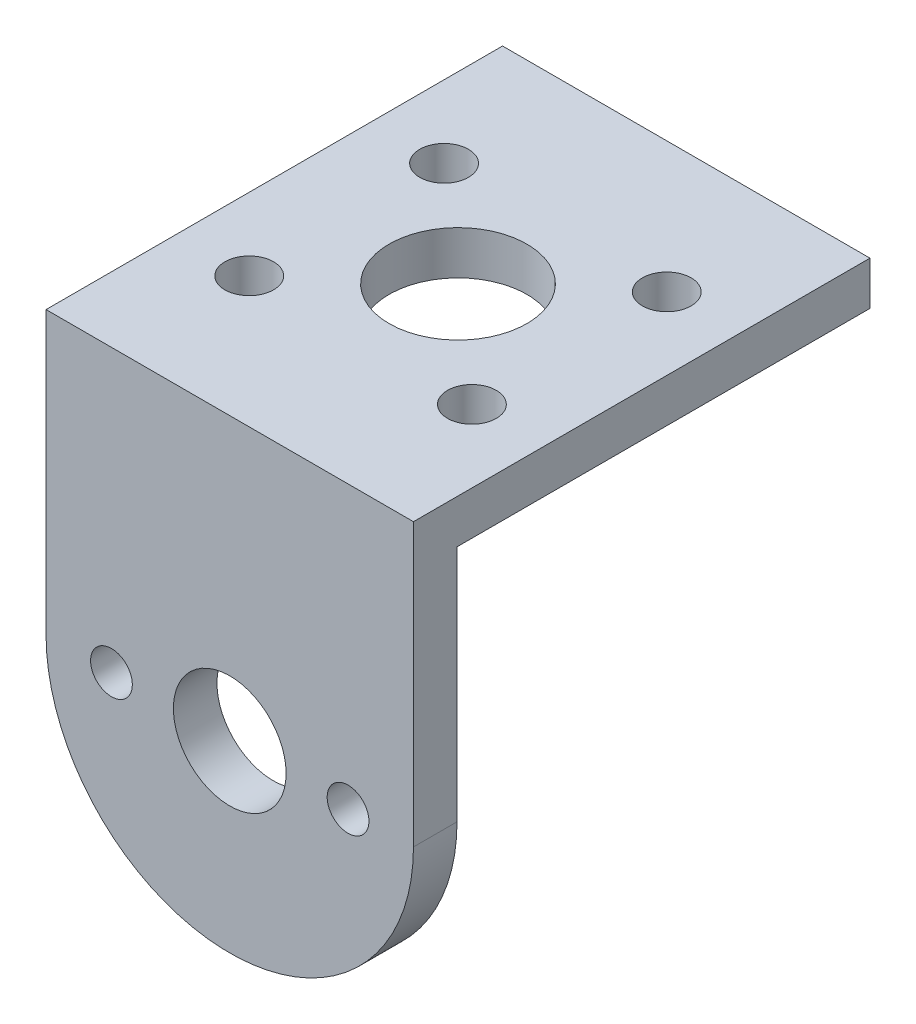
ISO-10303-21;
HEADER;
FILE_DESCRIPTION(('STEP AP214'),'2;1');
FILE_NAME('part.step','',(''),(''),'','','');
FILE_SCHEMA(('AUTOMOTIVE_DESIGN { 1 0 10303 214 1 1 1 1 }'));
ENDSEC;
DATA;
#1=APPLICATION_CONTEXT('core data for automotive mechanical design processes');
#2=APPLICATION_PROTOCOL_DEFINITION('international standard','automotive_design',2000,#1);
#3=PRODUCT_CONTEXT('',#1,'mechanical');
#4=PRODUCT('Part','Part','',(#3));
#5=PRODUCT_RELATED_PRODUCT_CATEGORY('part','',(#4));
#6=PRODUCT_DEFINITION_FORMATION('','',#4);
#7=PRODUCT_DEFINITION_CONTEXT('part definition',#1,'design');
#8=PRODUCT_DEFINITION('design','',#6,#7);
#9=PRODUCT_DEFINITION_SHAPE('','',#8);
#10=(LENGTH_UNIT() NAMED_UNIT(*) SI_UNIT(.MILLI.,.METRE.));
#11=(NAMED_UNIT(*) PLANE_ANGLE_UNIT() SI_UNIT($,.RADIAN.));
#12=(NAMED_UNIT(*) SI_UNIT($,.STERADIAN.) SOLID_ANGLE_UNIT());
#13=UNCERTAINTY_MEASURE_WITH_UNIT(LENGTH_MEASURE(1.E-05),#10,'distance_accuracy_value','');
#14=(GEOMETRIC_REPRESENTATION_CONTEXT(3) GLOBAL_UNCERTAINTY_ASSIGNED_CONTEXT((#13)) GLOBAL_UNIT_ASSIGNED_CONTEXT((#10,
#11,#12)) REPRESENTATION_CONTEXT('',''));
#15=CARTESIAN_POINT('',(0.,0.,0.));
#16=DIRECTION('',(0.,0.,1.));
#17=DIRECTION('',(1.,0.,0.));
#18=AXIS2_PLACEMENT_3D('',#15,#16,#17);
#19=CARTESIAN_POINT('',(0.,0.,-3.13));
#20=DIRECTION('',(0.,0.,1.));
#21=DIRECTION('',(1.,0.,0.));
#22=AXIS2_PLACEMENT_3D('',#19,#20,#21);
#23=PLANE('',#22);
#24=CARTESIAN_POINT('',(0.,0.,-3.13));
#25=DIRECTION('',(0.,0.,1.));
#26=DIRECTION('',(1.,0.,0.));
#27=AXIS2_PLACEMENT_3D('',#24,#25,#26);
#28=CIRCLE('',#27,4.05);
#29=CARTESIAN_POINT('',(4.05,0.,-3.13));
#30=VERTEX_POINT('',#29);
#31=EDGE_CURVE('E130',#30,#30,#28,.T.);
#32=ORIENTED_EDGE('',*,*,#31,.T.);
#33=EDGE_LOOP('',(#32));
#34=FACE_BOUND('',#33,.T.);
#35=CARTESIAN_POINT('',(8.5,0.,-3.13));
#36=DIRECTION('',(0.,0.,1.));
#37=DIRECTION('',(1.,0.,0.));
#38=AXIS2_PLACEMENT_3D('',#35,#36,#37);
#39=CIRCLE('',#38,1.5);
#40=CARTESIAN_POINT('',(10.,0.,-3.13));
#41=VERTEX_POINT('',#40);
#42=EDGE_CURVE('E121',#41,#41,#39,.T.);
#43=ORIENTED_EDGE('',*,*,#42,.T.);
#44=EDGE_LOOP('',(#43));
#45=FACE_BOUND('',#44,.T.);
#46=CARTESIAN_POINT('',(-8.5,0.,-3.13));
#47=DIRECTION('',(0.,0.,1.));
#48=DIRECTION('',(1.,0.,0.));
#49=AXIS2_PLACEMENT_3D('',#46,#47,#48);
#50=CIRCLE('',#49,1.5);
#51=CARTESIAN_POINT('',(-7.,0.,-3.13));
#52=VERTEX_POINT('',#51);
#53=EDGE_CURVE('E126',#52,#52,#50,.T.);
#54=ORIENTED_EDGE('',*,*,#53,.T.);
#55=EDGE_LOOP('',(#54));
#56=FACE_BOUND('',#55,.T.);
#57=DIRECTION('',(-1.,0.,0.));
#58=VECTOR('',#57,1.);
#59=CARTESIAN_POINT('',(0.,17.11,-3.13));
#60=LINE('',#59,#58);
#61=CARTESIAN_POINT('',(13.2,17.11,-3.13));
#62=VERTEX_POINT('',#61);
#63=CARTESIAN_POINT('',(-13.2,17.11,-3.13));
#64=VERTEX_POINT('',#63);
#65=EDGE_CURVE('E52',#62,#64,#60,.T.);
#66=ORIENTED_EDGE('',*,*,#65,.F.);
#67=DIRECTION('',(0.,-1.,0.));
#68=VECTOR('',#67,1.);
#69=CARTESIAN_POINT('',(13.2,0.,-3.13));
#70=LINE('',#69,#68);
#71=CARTESIAN_POINT('',(13.2,0.,-3.13));
#72=VERTEX_POINT('',#71);
#73=EDGE_CURVE('E96',#62,#72,#70,.T.);
#74=ORIENTED_EDGE('',*,*,#73,.T.);
#75=CARTESIAN_POINT('',(0.,0.,-3.13));
#76=DIRECTION('',(0.,0.,1.));
#77=DIRECTION('',(1.,0.,0.));
#78=AXIS2_PLACEMENT_3D('',#75,#76,#77);
#79=CIRCLE('',#78,13.2);
#80=CARTESIAN_POINT('',(-13.2,0.,-3.13));
#81=VERTEX_POINT('',#80);
#82=EDGE_CURVE('E136',#81,#72,#79,.T.);
#83=ORIENTED_EDGE('',*,*,#82,.F.);
#84=DIRECTION('',(0.,-1.,0.));
#85=VECTOR('',#84,1.);
#86=CARTESIAN_POINT('',(-13.2,0.,-3.13));
#87=LINE('',#86,#85);
#88=EDGE_CURVE('E57',#64,#81,#87,.T.);
#89=ORIENTED_EDGE('',*,*,#88,.F.);
#90=EDGE_LOOP('',(#66,#74,#83,#89));
#91=FACE_BOUND('',#90,.T.);
#92=ADVANCED_FACE('F35',(#34,#45,#56,#91),#23,.F.);
#93=CARTESIAN_POINT('',(0.,0.,-3.13));
#94=DIRECTION('',(0.,0.,1.));
#95=DIRECTION('',(1.,0.,0.));
#96=AXIS2_PLACEMENT_3D('',#93,#94,#95);
#97=CYLINDRICAL_SURFACE('',#96,13.2);
#98=CARTESIAN_POINT('',(0.,0.,0.));
#99=DIRECTION('',(0.,0.,1.));
#100=DIRECTION('',(1.,0.,0.));
#101=AXIS2_PLACEMENT_3D('',#98,#99,#100);
#102=CIRCLE('',#101,13.2);
#103=CARTESIAN_POINT('',(-13.2,0.,0.));
#104=VERTEX_POINT('',#103);
#105=CARTESIAN_POINT('',(13.2,0.,0.));
#106=VERTEX_POINT('',#105);
#107=EDGE_CURVE('E133',#104,#106,#102,.T.);
#108=ORIENTED_EDGE('',*,*,#107,.F.);
#109=DIRECTION('',(0.,0.,1.));
#110=VECTOR('',#109,1.);
#111=CARTESIAN_POINT('',(-13.2,0.,-3.13));
#112=LINE('',#111,#110);
#113=EDGE_CURVE('E11',#81,#104,#112,.T.);
#114=ORIENTED_EDGE('',*,*,#113,.F.);
#115=ORIENTED_EDGE('',*,*,#82,.T.);
#116=DIRECTION('',(0.,0.,1.));
#117=VECTOR('',#116,1.);
#118=CARTESIAN_POINT('',(13.2,0.,-3.13));
#119=LINE('',#118,#117);
#120=EDGE_CURVE('E39',#72,#106,#119,.T.);
#121=ORIENTED_EDGE('',*,*,#120,.T.);
#122=EDGE_LOOP('',(#108,#114,#115,#121));
#123=FACE_BOUND('',#122,.T.);
#124=ADVANCED_FACE('F37',(#123),#97,.T.);
#125=CARTESIAN_POINT('',(-13.2,0.,-3.13));
#126=DIRECTION('',(-1.,0.,0.));
#127=DIRECTION('',(0.,-1.,0.));
#128=AXIS2_PLACEMENT_3D('',#125,#126,#127);
#129=PLANE('',#128);
#130=DIRECTION('',(0.,0.,-1.));
#131=VECTOR('',#130,1.);
#132=CARTESIAN_POINT('',(-13.2,17.11,0.));
#133=LINE('',#132,#131);
#134=CARTESIAN_POINT('',(-13.2,17.11,-32.8));
#135=VERTEX_POINT('',#134);
#136=EDGE_CURVE('E98',#64,#135,#133,.T.);
#137=ORIENTED_EDGE('',*,*,#136,.F.);
#138=ORIENTED_EDGE('',*,*,#88,.T.);
#139=ORIENTED_EDGE('',*,*,#113,.T.);
#140=DIRECTION('',(0.,-1.,0.));
#141=VECTOR('',#140,1.);
#142=CARTESIAN_POINT('',(-13.2,0.,0.));
#143=LINE('',#142,#141);
#144=CARTESIAN_POINT('',(-13.2,20.24,0.));
#145=VERTEX_POINT('',#144);
#146=EDGE_CURVE('E139',#145,#104,#143,.T.);
#147=ORIENTED_EDGE('',*,*,#146,.F.);
#148=DIRECTION('',(0.,0.,1.));
#149=VECTOR('',#148,1.);
#150=CARTESIAN_POINT('',(-13.2,20.24,-3.13));
#151=LINE('',#150,#149);
#152=CARTESIAN_POINT('',(-13.2,20.24,-32.8));
#153=VERTEX_POINT('',#152);
#154=EDGE_CURVE('E44',#153,#145,#151,.T.);
#155=ORIENTED_EDGE('',*,*,#154,.F.);
#156=DIRECTION('',(0.,1.,0.));
#157=VECTOR('',#156,1.);
#158=CARTESIAN_POINT('',(-13.2,17.11,-32.8));
#159=LINE('',#158,#157);
#160=EDGE_CURVE('E111',#135,#153,#159,.T.);
#161=ORIENTED_EDGE('',*,*,#160,.F.);
#162=EDGE_LOOP('',(#137,#138,#139,#147,#155,#161));
#163=FACE_BOUND('',#162,.T.);
#164=ADVANCED_FACE('F161',(#163),#129,.T.);
#165=CARTESIAN_POINT('',(0.,20.24,-3.13));
#166=DIRECTION('',(0.,-1.,0.));
#167=DIRECTION('',(0.,0.,-1.));
#168=AXIS2_PLACEMENT_3D('',#165,#166,#167);
#169=PLANE('',#168);
#170=CARTESIAN_POINT('',(8.,20.24,-23.4));
#171=DIRECTION('',(0.,1.,0.));
#172=DIRECTION('',(0.,0.,1.));
#173=AXIS2_PLACEMENT_3D('',#170,#171,#172);
#174=CIRCLE('',#173,1.75);
#175=CARTESIAN_POINT('',(8.,20.24,-21.65));
#176=VERTEX_POINT('',#175);
#177=EDGE_CURVE('E336',#176,#176,#174,.T.);
#178=ORIENTED_EDGE('',*,*,#177,.F.);
#179=EDGE_LOOP('',(#178));
#180=FACE_BOUND('',#179,.T.);
#181=CARTESIAN_POINT('',(-8.,20.24,-9.4));
#182=DIRECTION('',(0.,1.,0.));
#183=DIRECTION('',(0.,0.,1.));
#184=AXIS2_PLACEMENT_3D('',#181,#182,#183);
#185=CIRCLE('',#184,1.75);
#186=CARTESIAN_POINT('',(-8.,20.24,-7.65));
#187=VERTEX_POINT('',#186);
#188=EDGE_CURVE('E342',#187,#187,#185,.T.);
#189=ORIENTED_EDGE('',*,*,#188,.F.);
#190=EDGE_LOOP('',(#189));
#191=FACE_BOUND('',#190,.T.);
#192=CARTESIAN_POINT('',(-8.,20.24,-23.4));
#193=DIRECTION('',(0.,1.,0.));
#194=DIRECTION('',(0.,0.,1.));
#195=AXIS2_PLACEMENT_3D('',#192,#193,#194);
#196=CIRCLE('',#195,1.75);
#197=CARTESIAN_POINT('',(-8.,20.24,-21.65));
#198=VERTEX_POINT('',#197);
#199=EDGE_CURVE('E374',#198,#198,#196,.T.);
#200=ORIENTED_EDGE('',*,*,#199,.F.);
#201=EDGE_LOOP('',(#200));
#202=FACE_BOUND('',#201,.T.);
#203=CARTESIAN_POINT('',(8.,20.24,-9.4));
#204=DIRECTION('',(0.,1.,0.));
#205=DIRECTION('',(0.,0.,1.));
#206=AXIS2_PLACEMENT_3D('',#203,#204,#205);
#207=CIRCLE('',#206,1.75);
#208=CARTESIAN_POINT('',(8.,20.24,-7.65));
#209=VERTEX_POINT('',#208);
#210=EDGE_CURVE('E339',#209,#209,#207,.T.);
#211=ORIENTED_EDGE('',*,*,#210,.F.);
#212=EDGE_LOOP('',(#211));
#213=FACE_BOUND('',#212,.T.);
#214=CARTESIAN_POINT('',(0.,20.24,-16.4));
#215=DIRECTION('',(0.,1.,0.));
#216=DIRECTION('',(0.,0.,1.));
#217=AXIS2_PLACEMENT_3D('',#214,#215,#216);
#218=CIRCLE('',#217,4.95);
#219=CARTESIAN_POINT('',(0.,20.24,-11.45));
#220=VERTEX_POINT('',#219);
#221=EDGE_CURVE('E352',#220,#220,#218,.T.);
#222=ORIENTED_EDGE('',*,*,#221,.F.);
#223=EDGE_LOOP('',(#222));
#224=FACE_BOUND('',#223,.T.);
#225=DIRECTION('',(1.,0.,0.));
#226=VECTOR('',#225,1.);
#227=CARTESIAN_POINT('',(0.,20.24,0.));
#228=LINE('',#227,#226);
#229=CARTESIAN_POINT('',(13.2,20.24,0.));
#230=VERTEX_POINT('',#229);
#231=EDGE_CURVE('E146',#145,#230,#228,.T.);
#232=ORIENTED_EDGE('',*,*,#231,.T.);
#233=DIRECTION('',(0.,0.,1.));
#234=VECTOR('',#233,1.);
#235=CARTESIAN_POINT('',(13.2,20.24,-3.13));
#236=LINE('',#235,#234);
#237=CARTESIAN_POINT('',(13.2,20.24,-32.8));
#238=VERTEX_POINT('',#237);
#239=EDGE_CURVE('E149',#238,#230,#236,.T.);
#240=ORIENTED_EDGE('',*,*,#239,.F.);
#241=DIRECTION('',(1.,0.,0.));
#242=VECTOR('',#241,1.);
#243=CARTESIAN_POINT('',(-13.2,20.24,-32.8));
#244=LINE('',#243,#242);
#245=EDGE_CURVE('E107',#153,#238,#244,.T.);
#246=ORIENTED_EDGE('',*,*,#245,.F.);
#247=ORIENTED_EDGE('',*,*,#154,.T.);
#248=EDGE_LOOP('',(#232,#240,#246,#247));
#249=FACE_BOUND('',#248,.T.);
#250=ADVANCED_FACE('F177',(#180,#191,#202,#213,#224,#249),#169,.F.);
#251=CARTESIAN_POINT('',(13.2,0.,-3.13));
#252=DIRECTION('',(-1.,0.,0.));
#253=DIRECTION('',(0.,-1.,0.));
#254=AXIS2_PLACEMENT_3D('',#251,#252,#253);
#255=PLANE('',#254);
#256=DIRECTION('',(0.,-1.,0.));
#257=VECTOR('',#256,1.);
#258=CARTESIAN_POINT('',(13.2,0.,0.));
#259=LINE('',#258,#257);
#260=EDGE_CURVE('E144',#230,#106,#259,.T.);
#261=ORIENTED_EDGE('',*,*,#260,.T.);
#262=ORIENTED_EDGE('',*,*,#120,.F.);
#263=ORIENTED_EDGE('',*,*,#73,.F.);
#264=DIRECTION('',(0.,0.,-1.));
#265=VECTOR('',#264,1.);
#266=CARTESIAN_POINT('',(13.2,17.11,0.));
#267=LINE('',#266,#265);
#268=CARTESIAN_POINT('',(13.2,17.11,-32.8));
#269=VERTEX_POINT('',#268);
#270=EDGE_CURVE('E88',#62,#269,#267,.T.);
#271=ORIENTED_EDGE('',*,*,#270,.T.);
#272=DIRECTION('',(0.,1.,0.));
#273=VECTOR('',#272,1.);
#274=CARTESIAN_POINT('',(13.2,17.11,-32.8));
#275=LINE('',#274,#273);
#276=EDGE_CURVE('E93',#269,#238,#275,.T.);
#277=ORIENTED_EDGE('',*,*,#276,.T.);
#278=ORIENTED_EDGE('',*,*,#239,.T.);
#279=EDGE_LOOP('',(#261,#262,#263,#271,#277,#278));
#280=FACE_BOUND('',#279,.T.);
#281=ADVANCED_FACE('F90',(#280),#255,.F.);
#282=CARTESIAN_POINT('',(0.,0.,0.));
#283=DIRECTION('',(0.,0.,1.));
#284=DIRECTION('',(1.,0.,0.));
#285=AXIS2_PLACEMENT_3D('',#282,#283,#284);
#286=PLANE('',#285);
#287=ORIENTED_EDGE('',*,*,#146,.T.);
#288=ORIENTED_EDGE('',*,*,#107,.T.);
#289=ORIENTED_EDGE('',*,*,#260,.F.);
#290=ORIENTED_EDGE('',*,*,#231,.F.);
#291=EDGE_LOOP('',(#287,#288,#289,#290));
#292=FACE_BOUND('',#291,.T.);
#293=CARTESIAN_POINT('',(-8.5,0.,0.));
#294=DIRECTION('',(0.,0.,1.));
#295=DIRECTION('',(1.,0.,0.));
#296=AXIS2_PLACEMENT_3D('',#293,#294,#295);
#297=CIRCLE('',#296,1.5);
#298=CARTESIAN_POINT('',(-7.,0.,0.));
#299=VERTEX_POINT('',#298);
#300=EDGE_CURVE('E118',#299,#299,#297,.T.);
#301=ORIENTED_EDGE('',*,*,#300,.F.);
#302=EDGE_LOOP('',(#301));
#303=FACE_BOUND('',#302,.T.);
#304=CARTESIAN_POINT('',(8.5,0.,0.));
#305=DIRECTION('',(0.,0.,1.));
#306=DIRECTION('',(1.,0.,0.));
#307=AXIS2_PLACEMENT_3D('',#304,#305,#306);
#308=CIRCLE('',#307,1.5);
#309=CARTESIAN_POINT('',(10.,0.,0.));
#310=VERTEX_POINT('',#309);
#311=EDGE_CURVE('E113',#310,#310,#308,.T.);
#312=ORIENTED_EDGE('',*,*,#311,.F.);
#313=EDGE_LOOP('',(#312));
#314=FACE_BOUND('',#313,.T.);
#315=CARTESIAN_POINT('',(0.,0.,0.));
#316=DIRECTION('',(0.,0.,1.));
#317=DIRECTION('',(1.,0.,0.));
#318=AXIS2_PLACEMENT_3D('',#315,#316,#317);
#319=CIRCLE('',#318,4.05);
#320=CARTESIAN_POINT('',(4.05,0.,0.));
#321=VERTEX_POINT('',#320);
#322=EDGE_CURVE('E129',#321,#321,#319,.T.);
#323=ORIENTED_EDGE('',*,*,#322,.F.);
#324=EDGE_LOOP('',(#323));
#325=FACE_BOUND('',#324,.T.);
#326=ADVANCED_FACE('F156',(#292,#303,#314,#325),#286,.T.);
#327=CARTESIAN_POINT('',(0.,0.,-3.13));
#328=DIRECTION('',(0.,0.,1.));
#329=DIRECTION('',(1.,0.,0.));
#330=AXIS2_PLACEMENT_3D('',#327,#328,#329);
#331=CYLINDRICAL_SURFACE('',#330,4.05);
#332=ORIENTED_EDGE('',*,*,#31,.F.);
#333=EDGE_LOOP('',(#332));
#334=FACE_BOUND('',#333,.T.);
#335=ORIENTED_EDGE('',*,*,#322,.T.);
#336=EDGE_LOOP('',(#335));
#337=FACE_BOUND('',#336,.T.);
#338=ADVANCED_FACE('F171',(#334,#337),#331,.F.);
#339=CARTESIAN_POINT('',(8.5,0.,-17.));
#340=DIRECTION('',(0.,0.,1.));
#341=DIRECTION('',(1.,0.,0.));
#342=AXIS2_PLACEMENT_3D('',#339,#340,#341);
#343=CYLINDRICAL_SURFACE('',#342,1.5);
#344=ORIENTED_EDGE('',*,*,#311,.T.);
#345=EDGE_LOOP('',(#344));
#346=FACE_BOUND('',#345,.T.);
#347=ORIENTED_EDGE('',*,*,#42,.F.);
#348=EDGE_LOOP('',(#347));
#349=FACE_BOUND('',#348,.T.);
#350=ADVANCED_FACE('F197',(#346,#349),#343,.F.);
#351=CARTESIAN_POINT('',(-8.5,0.,-17.));
#352=DIRECTION('',(0.,0.,1.));
#353=DIRECTION('',(1.,0.,0.));
#354=AXIS2_PLACEMENT_3D('',#351,#352,#353);
#355=CYLINDRICAL_SURFACE('',#354,1.5);
#356=ORIENTED_EDGE('',*,*,#300,.T.);
#357=EDGE_LOOP('',(#356));
#358=FACE_BOUND('',#357,.T.);
#359=ORIENTED_EDGE('',*,*,#53,.F.);
#360=EDGE_LOOP('',(#359));
#361=FACE_BOUND('',#360,.T.);
#362=ADVANCED_FACE('F205',(#358,#361),#355,.F.);
#363=CARTESIAN_POINT('',(0.,17.11,0.));
#364=DIRECTION('',(0.,1.,0.));
#365=DIRECTION('',(0.,0.,1.));
#366=AXIS2_PLACEMENT_3D('',#363,#364,#365);
#367=PLANE('',#366);
#368=CARTESIAN_POINT('',(8.,17.11,-23.4));
#369=DIRECTION('',(0.,1.,0.));
#370=DIRECTION('',(0.,0.,1.));
#371=AXIS2_PLACEMENT_3D('',#368,#369,#370);
#372=CIRCLE('',#371,1.75);
#373=CARTESIAN_POINT('',(8.,17.11,-21.65));
#374=VERTEX_POINT('',#373);
#375=EDGE_CURVE('E333',#374,#374,#372,.T.);
#376=ORIENTED_EDGE('',*,*,#375,.T.);
#377=EDGE_LOOP('',(#376));
#378=FACE_BOUND('',#377,.T.);
#379=CARTESIAN_POINT('',(-8.,17.11,-9.4));
#380=DIRECTION('',(0.,1.,0.));
#381=DIRECTION('',(0.,0.,1.));
#382=AXIS2_PLACEMENT_3D('',#379,#380,#381);
#383=CIRCLE('',#382,1.75);
#384=CARTESIAN_POINT('',(-8.,17.11,-7.65));
#385=VERTEX_POINT('',#384);
#386=EDGE_CURVE('E337',#385,#385,#383,.T.);
#387=ORIENTED_EDGE('',*,*,#386,.T.);
#388=EDGE_LOOP('',(#387));
#389=FACE_BOUND('',#388,.T.);
#390=CARTESIAN_POINT('',(-8.,17.11,-23.4));
#391=DIRECTION('',(0.,1.,0.));
#392=DIRECTION('',(0.,0.,1.));
#393=AXIS2_PLACEMENT_3D('',#390,#391,#392);
#394=CIRCLE('',#393,1.75);
#395=CARTESIAN_POINT('',(-8.,17.11,-21.65));
#396=VERTEX_POINT('',#395);
#397=EDGE_CURVE('E348',#396,#396,#394,.T.);
#398=ORIENTED_EDGE('',*,*,#397,.T.);
#399=EDGE_LOOP('',(#398));
#400=FACE_BOUND('',#399,.T.);
#401=CARTESIAN_POINT('',(8.,17.11,-9.4));
#402=DIRECTION('',(0.,1.,0.));
#403=DIRECTION('',(0.,0.,1.));
#404=AXIS2_PLACEMENT_3D('',#401,#402,#403);
#405=CIRCLE('',#404,1.75);
#406=CARTESIAN_POINT('',(8.,17.11,-7.65));
#407=VERTEX_POINT('',#406);
#408=EDGE_CURVE('E349',#407,#407,#405,.T.);
#409=ORIENTED_EDGE('',*,*,#408,.T.);
#410=EDGE_LOOP('',(#409));
#411=FACE_BOUND('',#410,.T.);
#412=CARTESIAN_POINT('',(0.,17.11,-16.4));
#413=DIRECTION('',(0.,1.,0.));
#414=DIRECTION('',(0.,0.,1.));
#415=AXIS2_PLACEMENT_3D('',#412,#413,#414);
#416=CIRCLE('',#415,4.95);
#417=CARTESIAN_POINT('',(0.,17.11,-11.45));
#418=VERTEX_POINT('',#417);
#419=EDGE_CURVE('E355',#418,#418,#416,.T.);
#420=ORIENTED_EDGE('',*,*,#419,.T.);
#421=EDGE_LOOP('',(#420));
#422=FACE_BOUND('',#421,.T.);
#423=ORIENTED_EDGE('',*,*,#270,.F.);
#424=ORIENTED_EDGE('',*,*,#65,.T.);
#425=ORIENTED_EDGE('',*,*,#136,.T.);
#426=DIRECTION('',(1.,0.,0.));
#427=VECTOR('',#426,1.);
#428=CARTESIAN_POINT('',(-13.2,17.11,-32.8));
#429=LINE('',#428,#427);
#430=EDGE_CURVE('E99',#135,#269,#429,.T.);
#431=ORIENTED_EDGE('',*,*,#430,.T.);
#432=EDGE_LOOP('',(#423,#424,#425,#431));
#433=FACE_BOUND('',#432,.T.);
#434=ADVANCED_FACE('F102',(#378,#389,#400,#411,#422,#433),#367,.F.);
#435=CARTESIAN_POINT('',(-13.2,17.11,-32.8));
#436=DIRECTION('',(0.,0.,1.));
#437=DIRECTION('',(1.,0.,0.));
#438=AXIS2_PLACEMENT_3D('',#435,#436,#437);
#439=PLANE('',#438);
#440=ORIENTED_EDGE('',*,*,#245,.T.);
#441=ORIENTED_EDGE('',*,*,#276,.F.);
#442=ORIENTED_EDGE('',*,*,#430,.F.);
#443=ORIENTED_EDGE('',*,*,#160,.T.);
#444=EDGE_LOOP('',(#440,#441,#442,#443));
#445=FACE_BOUND('',#444,.T.);
#446=ADVANCED_FACE('F109',(#445),#439,.F.);
#447=CARTESIAN_POINT('',(0.,17.11,-16.4));
#448=DIRECTION('',(0.,1.,0.));
#449=DIRECTION('',(0.,0.,1.));
#450=AXIS2_PLACEMENT_3D('',#447,#448,#449);
#451=CYLINDRICAL_SURFACE('',#450,4.95);
#452=ORIENTED_EDGE('',*,*,#419,.F.);
#453=EDGE_LOOP('',(#452));
#454=FACE_BOUND('',#453,.T.);
#455=ORIENTED_EDGE('',*,*,#221,.T.);
#456=EDGE_LOOP('',(#455));
#457=FACE_BOUND('',#456,.T.);
#458=ADVANCED_FACE('F226',(#454,#457),#451,.F.);
#459=CARTESIAN_POINT('',(8.,17.11,-9.4));
#460=DIRECTION('',(0.,1.,0.));
#461=DIRECTION('',(0.,0.,1.));
#462=AXIS2_PLACEMENT_3D('',#459,#460,#461);
#463=CYLINDRICAL_SURFACE('',#462,1.75);
#464=ORIENTED_EDGE('',*,*,#408,.F.);
#465=EDGE_LOOP('',(#464));
#466=FACE_BOUND('',#465,.T.);
#467=ORIENTED_EDGE('',*,*,#210,.T.);
#468=EDGE_LOOP('',(#467));
#469=FACE_BOUND('',#468,.T.);
#470=ADVANCED_FACE('F233',(#466,#469),#463,.F.);
#471=CARTESIAN_POINT('',(-8.,17.11,-23.4));
#472=DIRECTION('',(0.,1.,0.));
#473=DIRECTION('',(0.,0.,1.));
#474=AXIS2_PLACEMENT_3D('',#471,#472,#473);
#475=CYLINDRICAL_SURFACE('',#474,1.75);
#476=ORIENTED_EDGE('',*,*,#397,.F.);
#477=EDGE_LOOP('',(#476));
#478=FACE_BOUND('',#477,.T.);
#479=ORIENTED_EDGE('',*,*,#199,.T.);
#480=EDGE_LOOP('',(#479));
#481=FACE_BOUND('',#480,.T.);
#482=ADVANCED_FACE('F240',(#478,#481),#475,.F.);
#483=CARTESIAN_POINT('',(-8.,17.11,-9.4));
#484=DIRECTION('',(0.,1.,0.));
#485=DIRECTION('',(0.,0.,1.));
#486=AXIS2_PLACEMENT_3D('',#483,#484,#485);
#487=CYLINDRICAL_SURFACE('',#486,1.75);
#488=ORIENTED_EDGE('',*,*,#386,.F.);
#489=EDGE_LOOP('',(#488));
#490=FACE_BOUND('',#489,.T.);
#491=ORIENTED_EDGE('',*,*,#188,.T.);
#492=EDGE_LOOP('',(#491));
#493=FACE_BOUND('',#492,.T.);
#494=ADVANCED_FACE('F248',(#490,#493),#487,.F.);
#495=CARTESIAN_POINT('',(8.,17.11,-23.4));
#496=DIRECTION('',(0.,1.,0.));
#497=DIRECTION('',(0.,0.,1.));
#498=AXIS2_PLACEMENT_3D('',#495,#496,#497);
#499=CYLINDRICAL_SURFACE('',#498,1.75);
#500=ORIENTED_EDGE('',*,*,#375,.F.);
#501=EDGE_LOOP('',(#500));
#502=FACE_BOUND('',#501,.T.);
#503=ORIENTED_EDGE('',*,*,#177,.T.);
#504=EDGE_LOOP('',(#503));
#505=FACE_BOUND('',#504,.T.);
#506=ADVANCED_FACE('F256',(#502,#505),#499,.F.);
#507=CLOSED_SHELL('',(#92,#124,#164,#250,#281,#326,#338,#350,#362,#434,#446,#458,#470,#482,#494,#506));
#508=MANIFOLD_SOLID_BREP('B2',#507);
#509=ADVANCED_BREP_SHAPE_REPRESENTATION('',(#18,#508),#14);
#510=SHAPE_DEFINITION_REPRESENTATION(#9,#509);
ENDSEC;
END-ISO-10303-21;
